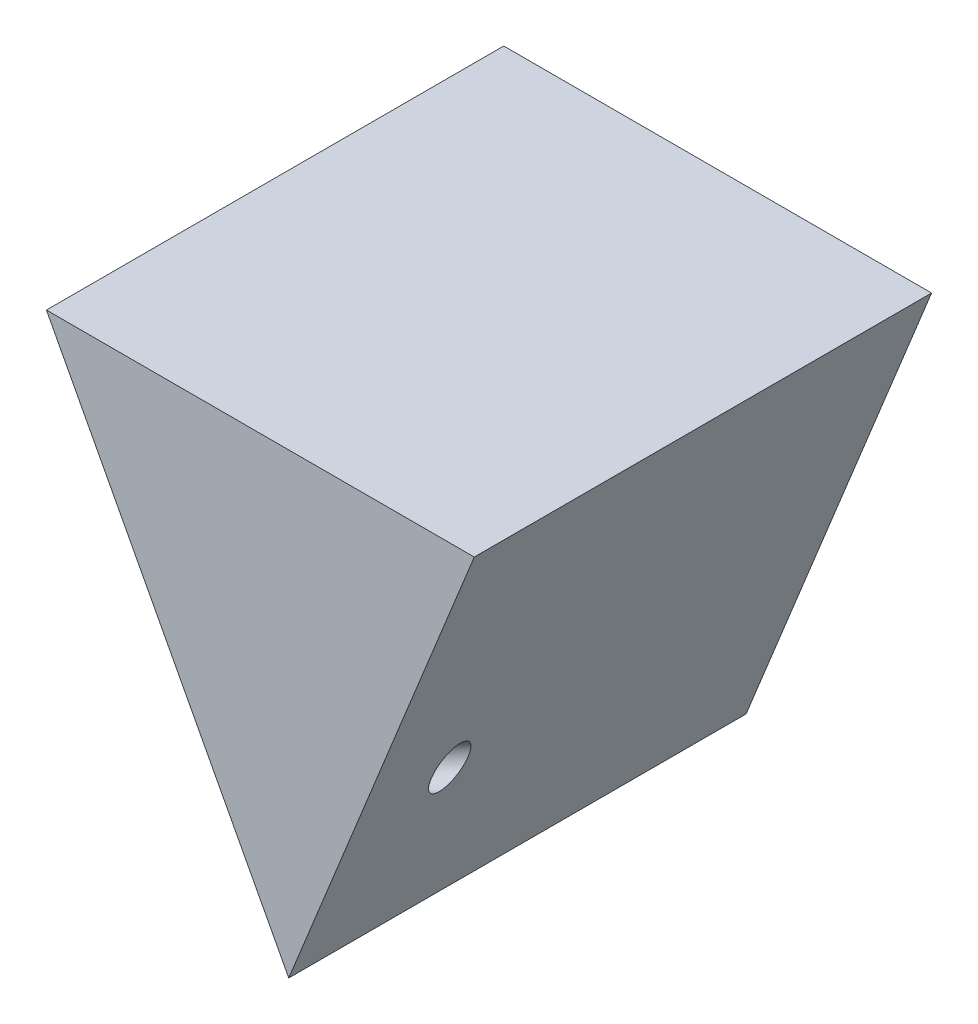
ISO-10303-21;
HEADER;
FILE_DESCRIPTION(('STEP AP214'),'2;1');
FILE_NAME('part.step','',(''),(''),'','','');
FILE_SCHEMA(('AUTOMOTIVE_DESIGN { 1 0 10303 214 1 1 1 1 }'));
ENDSEC;
DATA;
#1=APPLICATION_CONTEXT('core data for automotive mechanical design processes');
#2=APPLICATION_PROTOCOL_DEFINITION('international standard','automotive_design',2000,#1);
#3=PRODUCT_CONTEXT('',#1,'mechanical');
#4=PRODUCT('Part','Part','',(#3));
#5=PRODUCT_RELATED_PRODUCT_CATEGORY('part','',(#4));
#6=PRODUCT_DEFINITION_FORMATION('','',#4);
#7=PRODUCT_DEFINITION_CONTEXT('part definition',#1,'design');
#8=PRODUCT_DEFINITION('design','',#6,#7);
#9=PRODUCT_DEFINITION_SHAPE('','',#8);
#10=(LENGTH_UNIT() NAMED_UNIT(*) SI_UNIT(.MILLI.,.METRE.));
#11=(NAMED_UNIT(*) PLANE_ANGLE_UNIT() SI_UNIT($,.RADIAN.));
#12=(NAMED_UNIT(*) SI_UNIT($,.STERADIAN.) SOLID_ANGLE_UNIT());
#13=UNCERTAINTY_MEASURE_WITH_UNIT(LENGTH_MEASURE(1.E-05),#10,'distance_accuracy_value','');
#14=(GEOMETRIC_REPRESENTATION_CONTEXT(3) GLOBAL_UNCERTAINTY_ASSIGNED_CONTEXT((#13)) GLOBAL_UNIT_ASSIGNED_CONTEXT((#10,
#11,#12)) REPRESENTATION_CONTEXT('',''));
#15=CARTESIAN_POINT('',(0.,0.,0.));
#16=DIRECTION('',(0.,0.,1.));
#17=DIRECTION('',(1.,0.,0.));
#18=AXIS2_PLACEMENT_3D('',#15,#16,#17);
#19=CARTESIAN_POINT('',(10.5399062824928,19.241346542851,50.));
#20=DIRECTION('',(0.,-1.,0.));
#21=DIRECTION('',(1.,0.,0.));
#22=AXIS2_PLACEMENT_3D('',#19,#20,#21);
#23=PLANE('',#22);
#24=DIRECTION('',(-1.,0.,0.));
#25=VECTOR('',#24,1.);
#26=CARTESIAN_POINT('',(10.5399062824928,19.241346542851,0.));
#27=LINE('',#26,#25);
#28=CARTESIAN_POINT('',(10.5399062824928,19.241346542851,0.));
#29=VERTEX_POINT('',#28);
#30=CARTESIAN_POINT('',(-36.2386377440524,19.241346542851,0.));
#31=VERTEX_POINT('',#30);
#32=EDGE_CURVE('E80',#29,#31,#27,.T.);
#33=ORIENTED_EDGE('',*,*,#32,.T.);
#34=DIRECTION('',(0.,0.,-1.));
#35=VECTOR('',#34,1.);
#36=CARTESIAN_POINT('',(-36.2386377440524,19.241346542851,50.));
#37=LINE('',#36,#35);
#38=CARTESIAN_POINT('',(-36.2386377440524,19.241346542851,50.));
#39=VERTEX_POINT('',#38);
#40=EDGE_CURVE('E11',#39,#31,#37,.T.);
#41=ORIENTED_EDGE('',*,*,#40,.F.);
#42=DIRECTION('',(-1.,0.,0.));
#43=VECTOR('',#42,1.);
#44=CARTESIAN_POINT('',(10.5399062824928,19.241346542851,50.));
#45=LINE('',#44,#43);
#46=CARTESIAN_POINT('',(10.5399062824928,19.241346542851,50.));
#47=VERTEX_POINT('',#46);
#48=EDGE_CURVE('E73',#47,#39,#45,.T.);
#49=ORIENTED_EDGE('',*,*,#48,.F.);
#50=DIRECTION('',(0.,0.,-1.));
#51=VECTOR('',#50,1.);
#52=CARTESIAN_POINT('',(10.5399062824928,19.241346542851,50.));
#53=LINE('',#52,#51);
#54=EDGE_CURVE('E81',#47,#29,#53,.T.);
#55=ORIENTED_EDGE('',*,*,#54,.T.);
#56=EDGE_LOOP('',(#33,#41,#49,#55));
#57=FACE_BOUND('',#56,.T.);
#58=ADVANCED_FACE('F32',(#57),#23,.F.);
#59=CARTESIAN_POINT('',(-36.2386377440524,19.241346542851,50.));
#60=DIRECTION('',(0.883603043086009,0.468236758754741,0.));
#61=DIRECTION('',(-0.468236758754741,0.883603043086009,0.));
#62=AXIS2_PLACEMENT_3D('',#59,#60,#61);
#63=PLANE('',#62);
#64=CARTESIAN_POINT('',(-15.829838165013,-19.2718138970308,40.));
#65=DIRECTION('',(-0.883603043086009,-0.468236758754741,0.));
#66=DIRECTION('',(0.468236758754741,-0.883603043086009,0.));
#67=AXIS2_PLACEMENT_3D('',#64,#65,#66);
#68=CIRCLE('',#67,2.);
#69=CARTESIAN_POINT('',(-14.8933646475036,-21.0390199832029,40.));
#70=VERTEX_POINT('',#69);
#71=EDGE_CURVE('E86',#70,#70,#68,.T.);
#72=ORIENTED_EDGE('',*,*,#71,.F.);
#73=EDGE_LOOP('',(#72));
#74=FACE_BOUND('',#73,.T.);
#75=DIRECTION('',(0.468236758754741,-0.883603043086009,0.));
#76=VECTOR('',#75,1.);
#77=CARTESIAN_POINT('',(-36.2386377440524,19.241346542851,0.));
#78=LINE('',#77,#76);
#79=CARTESIAN_POINT('',(-9.74276030120141,-30.758653457149,0.));
#80=VERTEX_POINT('',#79);
#81=EDGE_CURVE('E61',#31,#80,#78,.T.);
#82=ORIENTED_EDGE('',*,*,#81,.T.);
#83=DIRECTION('',(0.,0.,-1.));
#84=VECTOR('',#83,1.);
#85=CARTESIAN_POINT('',(-9.74276030120141,-30.758653457149,50.));
#86=LINE('',#85,#84);
#87=CARTESIAN_POINT('',(-9.74276030120141,-30.758653457149,50.));
#88=VERTEX_POINT('',#87);
#89=EDGE_CURVE('E41',#88,#80,#86,.T.);
#90=ORIENTED_EDGE('',*,*,#89,.F.);
#91=DIRECTION('',(0.468236758754741,-0.883603043086009,0.));
#92=VECTOR('',#91,1.);
#93=CARTESIAN_POINT('',(-36.2386377440524,19.241346542851,50.));
#94=LINE('',#93,#92);
#95=EDGE_CURVE('E69',#39,#88,#94,.T.);
#96=ORIENTED_EDGE('',*,*,#95,.F.);
#97=ORIENTED_EDGE('',*,*,#40,.T.);
#98=EDGE_LOOP('',(#82,#90,#96,#97));
#99=FACE_BOUND('',#98,.T.);
#100=ADVANCED_FACE('F70',(#74,#99),#63,.F.);
#101=CARTESIAN_POINT('',(-9.74276030120141,-30.758653457149,50.));
#102=DIRECTION('',(-0.92665925508512,0.375902414151718,0.));
#103=DIRECTION('',(-0.375902414151718,-0.92665925508512,0.));
#104=AXIS2_PLACEMENT_3D('',#101,#102,#103);
#105=PLANE('',#104);
#106=CARTESIAN_POINT('',(-2.14035585168914,-12.0175169844327,40.));
#107=DIRECTION('',(-0.92665925508512,0.375902414151718,0.));
#108=DIRECTION('',(-0.375902414151718,-0.92665925508512,0.));
#109=AXIS2_PLACEMENT_3D('',#106,#107,#108);
#110=ELLIPSE('',#109,3.11144765372081,2.);
#111=CARTESIAN_POINT('',(-3.30995653622949,-14.900768749466,40.));
#112=VERTEX_POINT('',#111);
#113=EDGE_CURVE('E35',#112,#112,#110,.T.);
#114=ORIENTED_EDGE('',*,*,#113,.T.);
#115=EDGE_LOOP('',(#114));
#116=FACE_BOUND('',#115,.T.);
#117=DIRECTION('',(0.375902414151718,0.92665925508512,0.));
#118=VECTOR('',#117,1.);
#119=CARTESIAN_POINT('',(-9.74276030120141,-30.758653457149,0.));
#120=LINE('',#119,#118);
#121=EDGE_CURVE('E66',#80,#29,#120,.T.);
#122=ORIENTED_EDGE('',*,*,#121,.T.);
#123=ORIENTED_EDGE('',*,*,#54,.F.);
#124=DIRECTION('',(0.375902414151718,0.92665925508512,0.));
#125=VECTOR('',#124,1.);
#126=CARTESIAN_POINT('',(-9.74276030120141,-30.758653457149,50.));
#127=LINE('',#126,#125);
#128=EDGE_CURVE('E49',#88,#47,#127,.T.);
#129=ORIENTED_EDGE('',*,*,#128,.F.);
#130=ORIENTED_EDGE('',*,*,#89,.T.);
#131=EDGE_LOOP('',(#122,#123,#129,#130));
#132=FACE_BOUND('',#131,.T.);
#133=ADVANCED_FACE('F91',(#116,#132),#105,.F.);
#134=CARTESIAN_POINT('',(0.,0.,50.));
#135=DIRECTION('',(0.,0.,-1.));
#136=DIRECTION('',(-1.,0.,0.));
#137=AXIS2_PLACEMENT_3D('',#134,#135,#136);
#138=PLANE('',#137);
#139=ORIENTED_EDGE('',*,*,#48,.T.);
#140=ORIENTED_EDGE('',*,*,#95,.T.);
#141=ORIENTED_EDGE('',*,*,#128,.T.);
#142=EDGE_LOOP('',(#139,#140,#141));
#143=FACE_BOUND('',#142,.T.);
#144=ADVANCED_FACE('F76',(#143),#138,.F.);
#145=CARTESIAN_POINT('',(0.,0.,0.));
#146=DIRECTION('',(0.,0.,-1.));
#147=DIRECTION('',(-1.,0.,0.));
#148=AXIS2_PLACEMENT_3D('',#145,#146,#147);
#149=PLANE('',#148);
#150=ORIENTED_EDGE('',*,*,#32,.F.);
#151=ORIENTED_EDGE('',*,*,#121,.F.);
#152=ORIENTED_EDGE('',*,*,#81,.F.);
#153=EDGE_LOOP('',(#150,#151,#152));
#154=FACE_BOUND('',#153,.T.);
#155=ADVANCED_FACE('F92',(#154),#149,.T.);
#156=CARTESIAN_POINT('',(28.3503139892874,4.14002404070618,40.));
#157=DIRECTION('',(-0.883603043086009,-0.468236758754741,0.));
#158=DIRECTION('',(0.468236758754741,-0.883603043086009,0.));
#159=AXIS2_PLACEMENT_3D('',#156,#157,#158);
#160=CYLINDRICAL_SURFACE('',#159,2.);
#161=ORIENTED_EDGE('',*,*,#71,.T.);
#162=EDGE_LOOP('',(#161));
#163=FACE_BOUND('',#162,.T.);
#164=ORIENTED_EDGE('',*,*,#113,.F.);
#165=EDGE_LOOP('',(#164));
#166=FACE_BOUND('',#165,.T.);
#167=ADVANCED_FACE('F94',(#163,#166),#160,.F.);
#168=CLOSED_SHELL('',(#58,#100,#133,#144,#155,#167));
#169=MANIFOLD_SOLID_BREP('B2',#168);
#170=ADVANCED_BREP_SHAPE_REPRESENTATION('',(#18,#169),#14);
#171=SHAPE_DEFINITION_REPRESENTATION(#9,#170);
ENDSEC;
END-ISO-10303-21;
